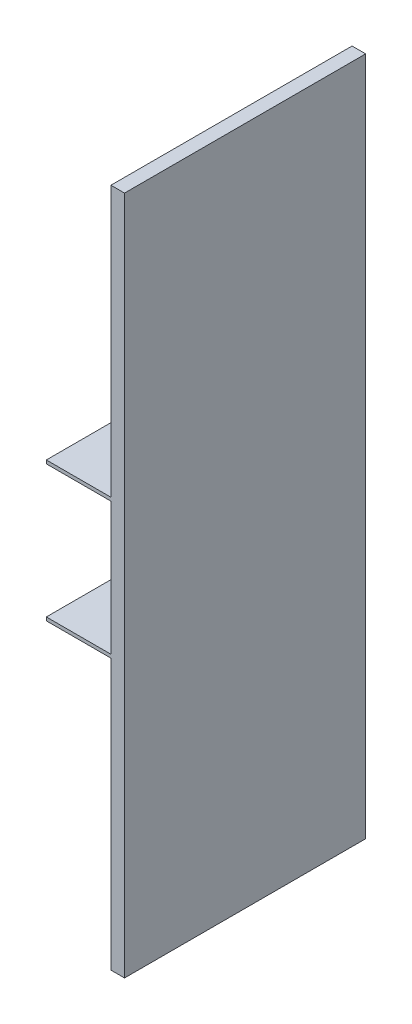
ISO-10303-21;
HEADER;
FILE_DESCRIPTION(('STEP AP214'),'2;1');
FILE_NAME('part.step','',(''),(''),'','','');
FILE_SCHEMA(('AUTOMOTIVE_DESIGN { 1 0 10303 214 1 1 1 1 }'));
ENDSEC;
DATA;
#1=APPLICATION_CONTEXT('core data for automotive mechanical design processes');
#2=APPLICATION_PROTOCOL_DEFINITION('international standard','automotive_design',2000,#1);
#3=PRODUCT_CONTEXT('',#1,'mechanical');
#4=PRODUCT('Part','Part','',(#3));
#5=PRODUCT_RELATED_PRODUCT_CATEGORY('part','',(#4));
#6=PRODUCT_DEFINITION_FORMATION('','',#4);
#7=PRODUCT_DEFINITION_CONTEXT('part definition',#1,'design');
#8=PRODUCT_DEFINITION('design','',#6,#7);
#9=PRODUCT_DEFINITION_SHAPE('','',#8);
#10=(LENGTH_UNIT() NAMED_UNIT(*) SI_UNIT(.MILLI.,.METRE.));
#11=(NAMED_UNIT(*) PLANE_ANGLE_UNIT() SI_UNIT($,.RADIAN.));
#12=(NAMED_UNIT(*) SI_UNIT($,.STERADIAN.) SOLID_ANGLE_UNIT());
#13=UNCERTAINTY_MEASURE_WITH_UNIT(LENGTH_MEASURE(1.E-05),#10,'distance_accuracy_value','');
#14=(GEOMETRIC_REPRESENTATION_CONTEXT(3) GLOBAL_UNCERTAINTY_ASSIGNED_CONTEXT((#13)) GLOBAL_UNIT_ASSIGNED_CONTEXT((#10,
#11,#12)) REPRESENTATION_CONTEXT('',''));
#15=CARTESIAN_POINT('',(0.,0.,0.));
#16=DIRECTION('',(0.,0.,1.));
#17=DIRECTION('',(1.,0.,0.));
#18=AXIS2_PLACEMENT_3D('',#15,#16,#17);
#19=CARTESIAN_POINT('',(7.5,0.,-35.475));
#20=DIRECTION('',(1.,0.,0.));
#21=DIRECTION('',(0.,0.,-1.));
#22=AXIS2_PLACEMENT_3D('',#19,#20,#21);
#23=PLANE('',#22);
#24=DIRECTION('',(0.,0.,1.));
#25=VECTOR('',#24,1.);
#26=CARTESIAN_POINT('',(7.5,119.5,-35.475));
#27=LINE('',#26,#25);
#28=CARTESIAN_POINT('',(7.5,119.5,-35.475));
#29=VERTEX_POINT('',#28);
#30=CARTESIAN_POINT('',(7.50000000000001,119.5,35.475));
#31=VERTEX_POINT('',#30);
#32=EDGE_CURVE('E58',#29,#31,#27,.T.);
#33=ORIENTED_EDGE('',*,*,#32,.F.);
#34=DIRECTION('',(0.,1.,0.));
#35=VECTOR('',#34,1.);
#36=CARTESIAN_POINT('',(7.5,0.,-35.475));
#37=LINE('',#36,#35);
#38=CARTESIAN_POINT('',(7.5,80.5,-35.475));
#39=VERTEX_POINT('',#38);
#40=EDGE_CURVE('E149',#39,#29,#37,.T.);
#41=ORIENTED_EDGE('',*,*,#40,.F.);
#42=DIRECTION('',(0.,0.,-1.));
#43=VECTOR('',#42,1.);
#44=CARTESIAN_POINT('',(7.5,80.5,-35.475));
#45=LINE('',#44,#43);
#46=CARTESIAN_POINT('',(7.50000000000001,80.5,35.475));
#47=VERTEX_POINT('',#46);
#48=EDGE_CURVE('E153',#47,#39,#45,.T.);
#49=ORIENTED_EDGE('',*,*,#48,.F.);
#50=DIRECTION('',(0.,1.,0.));
#51=VECTOR('',#50,1.);
#52=CARTESIAN_POINT('',(7.50000000000001,0.,35.475));
#53=LINE('',#52,#51);
#54=EDGE_CURVE('E175',#47,#31,#53,.T.);
#55=ORIENTED_EDGE('',*,*,#54,.T.);
#56=EDGE_LOOP('',(#33,#41,#49,#55));
#57=FACE_BOUND('',#56,.T.);
#58=ADVANCED_FACE('F33',(#57),#23,.F.);
#59=DIRECTION('',(0.,0.,-1.));
#60=VECTOR('',#59,1.);
#61=CARTESIAN_POINT('',(7.5,120.5,-35.475));
#62=LINE('',#61,#60);
#63=CARTESIAN_POINT('',(7.50000000000001,120.5,35.475));
#64=VERTEX_POINT('',#63);
#65=CARTESIAN_POINT('',(7.5,120.5,-35.475));
#66=VERTEX_POINT('',#65);
#67=EDGE_CURVE('E144',#64,#66,#62,.T.);
#68=ORIENTED_EDGE('',*,*,#67,.F.);
#69=CARTESIAN_POINT('',(7.50000000000001,200.,35.475));
#70=VERTEX_POINT('',#69);
#71=EDGE_CURVE('E198',#64,#70,#53,.T.);
#72=ORIENTED_EDGE('',*,*,#71,.T.);
#73=DIRECTION('',(0.,0.,-1.));
#74=VECTOR('',#73,1.);
#75=CARTESIAN_POINT('',(7.5,200.,-35.475));
#76=LINE('',#75,#74);
#77=CARTESIAN_POINT('',(7.5,200.,-35.475));
#78=VERTEX_POINT('',#77);
#79=EDGE_CURVE('E187',#70,#78,#76,.T.);
#80=ORIENTED_EDGE('',*,*,#79,.T.);
#81=EDGE_CURVE('E37',#66,#78,#37,.T.);
#82=ORIENTED_EDGE('',*,*,#81,.F.);
#83=EDGE_LOOP('',(#68,#72,#80,#82));
#84=FACE_BOUND('',#83,.T.);
#85=ADVANCED_FACE('F237',(#84),#23,.F.);
#86=DIRECTION('',(0.,0.,1.));
#87=VECTOR('',#86,1.);
#88=CARTESIAN_POINT('',(7.5,79.5,-35.475));
#89=LINE('',#88,#87);
#90=CARTESIAN_POINT('',(7.5,79.5,-35.475));
#91=VERTEX_POINT('',#90);
#92=CARTESIAN_POINT('',(7.50000000000001,79.5,35.475));
#93=VERTEX_POINT('',#92);
#94=EDGE_CURVE('E150',#91,#93,#89,.T.);
#95=ORIENTED_EDGE('',*,*,#94,.F.);
#96=CARTESIAN_POINT('',(7.5,0.,-35.475));
#97=VERTEX_POINT('',#96);
#98=EDGE_CURVE('E211',#97,#91,#37,.T.);
#99=ORIENTED_EDGE('',*,*,#98,.F.);
#100=DIRECTION('',(0.,0.,-1.));
#101=VECTOR('',#100,1.);
#102=CARTESIAN_POINT('',(7.5,0.,-35.475));
#103=LINE('',#102,#101);
#104=CARTESIAN_POINT('',(7.50000000000001,0.,35.475));
#105=VERTEX_POINT('',#104);
#106=EDGE_CURVE('E199',#105,#97,#103,.T.);
#107=ORIENTED_EDGE('',*,*,#106,.F.);
#108=EDGE_CURVE('E208',#105,#93,#53,.T.);
#109=ORIENTED_EDGE('',*,*,#108,.T.);
#110=EDGE_LOOP('',(#95,#99,#107,#109));
#111=FACE_BOUND('',#110,.T.);
#112=ADVANCED_FACE('F244',(#111),#23,.F.);
#113=CARTESIAN_POINT('',(11.5,200.,-35.475));
#114=DIRECTION('',(-1.,0.,0.));
#115=DIRECTION('',(0.,0.,1.));
#116=AXIS2_PLACEMENT_3D('',#113,#114,#115);
#117=PLANE('',#116);
#118=DIRECTION('',(0.,0.,-1.));
#119=VECTOR('',#118,1.);
#120=CARTESIAN_POINT('',(11.5,0.,-35.475));
#121=LINE('',#120,#119);
#122=CARTESIAN_POINT('',(11.5,0.,35.475));
#123=VERTEX_POINT('',#122);
#124=CARTESIAN_POINT('',(11.5,0.,-35.475));
#125=VERTEX_POINT('',#124);
#126=EDGE_CURVE('E213',#123,#125,#121,.T.);
#127=ORIENTED_EDGE('',*,*,#126,.T.);
#128=DIRECTION('',(0.,-1.,0.));
#129=VECTOR('',#128,1.);
#130=CARTESIAN_POINT('',(11.5,200.,-35.475));
#131=LINE('',#130,#129);
#132=CARTESIAN_POINT('',(11.5,200.,-35.475));
#133=VERTEX_POINT('',#132);
#134=EDGE_CURVE('E11',#133,#125,#131,.T.);
#135=ORIENTED_EDGE('',*,*,#134,.F.);
#136=DIRECTION('',(0.,0.,-1.));
#137=VECTOR('',#136,1.);
#138=CARTESIAN_POINT('',(11.5,200.,-35.475));
#139=LINE('',#138,#137);
#140=CARTESIAN_POINT('',(11.5,200.,35.475));
#141=VERTEX_POINT('',#140);
#142=EDGE_CURVE('E204',#141,#133,#139,.T.);
#143=ORIENTED_EDGE('',*,*,#142,.F.);
#144=DIRECTION('',(0.,-1.,0.));
#145=VECTOR('',#144,1.);
#146=CARTESIAN_POINT('',(11.5,200.,35.475));
#147=LINE('',#146,#145);
#148=EDGE_CURVE('E43',#141,#123,#147,.T.);
#149=ORIENTED_EDGE('',*,*,#148,.T.);
#150=EDGE_LOOP('',(#127,#135,#143,#149));
#151=FACE_BOUND('',#150,.T.);
#152=ADVANCED_FACE('F35',(#151),#117,.F.);
#153=CARTESIAN_POINT('',(-11.5,200.,-35.475));
#154=DIRECTION('',(0.,0.,1.));
#155=DIRECTION('',(1.,0.,0.));
#156=AXIS2_PLACEMENT_3D('',#153,#154,#155);
#157=PLANE('',#156);
#158=DIRECTION('',(-1.,0.,0.));
#159=VECTOR('',#158,1.);
#160=CARTESIAN_POINT('',(-11.5,0.,-35.475));
#161=LINE('',#160,#159);
#162=EDGE_CURVE('E220',#125,#97,#161,.T.);
#163=ORIENTED_EDGE('',*,*,#162,.T.);
#164=ORIENTED_EDGE('',*,*,#98,.T.);
#165=DIRECTION('',(1.,0.,0.));
#166=VECTOR('',#165,1.);
#167=CARTESIAN_POINT('',(-11.5,79.5,-35.475));
#168=LINE('',#167,#166);
#169=CARTESIAN_POINT('',(-11.5,79.5,-35.475));
#170=VERTEX_POINT('',#169);
#171=EDGE_CURVE('E181',#170,#91,#168,.T.);
#172=ORIENTED_EDGE('',*,*,#171,.F.);
#173=DIRECTION('',(0.,-1.,0.));
#174=VECTOR('',#173,1.);
#175=CARTESIAN_POINT('',(-11.5,79.5,-35.475));
#176=LINE('',#175,#174);
#177=CARTESIAN_POINT('',(-11.5,80.5,-35.475));
#178=VERTEX_POINT('',#177);
#179=EDGE_CURVE('E159',#178,#170,#176,.T.);
#180=ORIENTED_EDGE('',*,*,#179,.F.);
#181=DIRECTION('',(1.,0.,0.));
#182=VECTOR('',#181,1.);
#183=CARTESIAN_POINT('',(-11.5,80.5,-35.475));
#184=LINE('',#183,#182);
#185=EDGE_CURVE('E168',#178,#39,#184,.T.);
#186=ORIENTED_EDGE('',*,*,#185,.T.);
#187=ORIENTED_EDGE('',*,*,#40,.T.);
#188=DIRECTION('',(1.,0.,0.));
#189=VECTOR('',#188,1.);
#190=CARTESIAN_POINT('',(-11.5,119.5,-35.475));
#191=LINE('',#190,#189);
#192=CARTESIAN_POINT('',(-11.5,119.5,-35.475));
#193=VERTEX_POINT('',#192);
#194=EDGE_CURVE('E129',#193,#29,#191,.T.);
#195=ORIENTED_EDGE('',*,*,#194,.F.);
#196=DIRECTION('',(0.,-1.,0.));
#197=VECTOR('',#196,1.);
#198=CARTESIAN_POINT('',(-11.5,120.5,-35.475));
#199=LINE('',#198,#197);
#200=CARTESIAN_POINT('',(-11.5,120.5,-35.475));
#201=VERTEX_POINT('',#200);
#202=EDGE_CURVE('E135',#201,#193,#199,.T.);
#203=ORIENTED_EDGE('',*,*,#202,.F.);
#204=DIRECTION('',(1.,0.,0.));
#205=VECTOR('',#204,1.);
#206=CARTESIAN_POINT('',(-11.5,120.5,-35.475));
#207=LINE('',#206,#205);
#208=EDGE_CURVE('E236',#201,#66,#207,.T.);
#209=ORIENTED_EDGE('',*,*,#208,.T.);
#210=ORIENTED_EDGE('',*,*,#81,.T.);
#211=DIRECTION('',(-1.,0.,0.));
#212=VECTOR('',#211,1.);
#213=CARTESIAN_POINT('',(-11.5,200.,-35.475));
#214=LINE('',#213,#212);
#215=EDGE_CURVE('E224',#133,#78,#214,.T.);
#216=ORIENTED_EDGE('',*,*,#215,.F.);
#217=ORIENTED_EDGE('',*,*,#134,.T.);
#218=EDGE_LOOP('',(#163,#164,#172,#180,#186,#187,#195,#203,#209,#210,#216,#217));
#219=FACE_BOUND('',#218,.T.);
#220=ADVANCED_FACE('F147',(#219),#157,.F.);
#221=CARTESIAN_POINT('',(-11.5,200.,35.475));
#222=DIRECTION('',(0.,0.,-1.));
#223=DIRECTION('',(-1.,0.,0.));
#224=AXIS2_PLACEMENT_3D('',#221,#222,#223);
#225=PLANE('',#224);
#226=DIRECTION('',(1.,0.,0.));
#227=VECTOR('',#226,1.);
#228=CARTESIAN_POINT('',(-11.5,200.,35.475));
#229=LINE('',#228,#227);
#230=EDGE_CURVE('E217',#70,#141,#229,.T.);
#231=ORIENTED_EDGE('',*,*,#230,.F.);
#232=ORIENTED_EDGE('',*,*,#71,.F.);
#233=DIRECTION('',(1.,0.,0.));
#234=VECTOR('',#233,1.);
#235=CARTESIAN_POINT('',(-11.5,120.5,35.475));
#236=LINE('',#235,#234);
#237=CARTESIAN_POINT('',(-11.5,120.5,35.475));
#238=VERTEX_POINT('',#237);
#239=EDGE_CURVE('E155',#238,#64,#236,.T.);
#240=ORIENTED_EDGE('',*,*,#239,.F.);
#241=DIRECTION('',(0.,1.,0.));
#242=VECTOR('',#241,1.);
#243=CARTESIAN_POINT('',(-11.5,120.5,35.475));
#244=LINE('',#243,#242);
#245=CARTESIAN_POINT('',(-11.5,119.5,35.475));
#246=VERTEX_POINT('',#245);
#247=EDGE_CURVE('E134',#246,#238,#244,.T.);
#248=ORIENTED_EDGE('',*,*,#247,.F.);
#249=DIRECTION('',(1.,0.,0.));
#250=VECTOR('',#249,1.);
#251=CARTESIAN_POINT('',(-11.5,119.5,35.475));
#252=LINE('',#251,#250);
#253=EDGE_CURVE('E131',#246,#31,#252,.T.);
#254=ORIENTED_EDGE('',*,*,#253,.T.);
#255=ORIENTED_EDGE('',*,*,#54,.F.);
#256=DIRECTION('',(1.,0.,0.));
#257=VECTOR('',#256,1.);
#258=CARTESIAN_POINT('',(-11.5,80.5,35.475));
#259=LINE('',#258,#257);
#260=CARTESIAN_POINT('',(-11.5,80.5,35.475));
#261=VERTEX_POINT('',#260);
#262=EDGE_CURVE('E182',#261,#47,#259,.T.);
#263=ORIENTED_EDGE('',*,*,#262,.F.);
#264=DIRECTION('',(0.,1.,0.));
#265=VECTOR('',#264,1.);
#266=CARTESIAN_POINT('',(-11.5,79.5,35.475));
#267=LINE('',#266,#265);
#268=CARTESIAN_POINT('',(-11.5,79.5,35.475));
#269=VERTEX_POINT('',#268);
#270=EDGE_CURVE('E164',#269,#261,#267,.T.);
#271=ORIENTED_EDGE('',*,*,#270,.F.);
#272=DIRECTION('',(1.,0.,0.));
#273=VECTOR('',#272,1.);
#274=CARTESIAN_POINT('',(-11.5,79.5,35.475));
#275=LINE('',#274,#273);
#276=EDGE_CURVE('E178',#269,#93,#275,.T.);
#277=ORIENTED_EDGE('',*,*,#276,.T.);
#278=ORIENTED_EDGE('',*,*,#108,.F.);
#279=DIRECTION('',(1.,0.,0.));
#280=VECTOR('',#279,1.);
#281=CARTESIAN_POINT('',(-11.5,0.,35.475));
#282=LINE('',#281,#280);
#283=EDGE_CURVE('E218',#105,#123,#282,.T.);
#284=ORIENTED_EDGE('',*,*,#283,.T.);
#285=ORIENTED_EDGE('',*,*,#148,.F.);
#286=EDGE_LOOP('',(#231,#232,#240,#248,#254,#255,#263,#271,#277,#278,#284,#285));
#287=FACE_BOUND('',#286,.T.);
#288=ADVANCED_FACE('F246',(#287),#225,.F.);
#289=CARTESIAN_POINT('',(0.,200.,0.));
#290=DIRECTION('',(0.,1.,0.));
#291=DIRECTION('',(0.,0.,1.));
#292=AXIS2_PLACEMENT_3D('',#289,#290,#291);
#293=PLANE('',#292);
#294=ORIENTED_EDGE('',*,*,#79,.F.);
#295=ORIENTED_EDGE('',*,*,#230,.T.);
#296=ORIENTED_EDGE('',*,*,#142,.T.);
#297=ORIENTED_EDGE('',*,*,#215,.T.);
#298=EDGE_LOOP('',(#294,#295,#296,#297));
#299=FACE_BOUND('',#298,.T.);
#300=ADVANCED_FACE('F231',(#299),#293,.T.);
#301=CARTESIAN_POINT('',(0.,0.,0.));
#302=DIRECTION('',(0.,1.,0.));
#303=DIRECTION('',(0.,0.,1.));
#304=AXIS2_PLACEMENT_3D('',#301,#302,#303);
#305=PLANE('',#304);
#306=ORIENTED_EDGE('',*,*,#283,.F.);
#307=ORIENTED_EDGE('',*,*,#106,.T.);
#308=ORIENTED_EDGE('',*,*,#162,.F.);
#309=ORIENTED_EDGE('',*,*,#126,.F.);
#310=EDGE_LOOP('',(#306,#307,#308,#309));
#311=FACE_BOUND('',#310,.T.);
#312=ADVANCED_FACE('F241',(#311),#305,.F.);
#313=CARTESIAN_POINT('',(-11.5,79.5,-35.475));
#314=DIRECTION('',(0.,1.,0.));
#315=DIRECTION('',(0.,0.,1.));
#316=AXIS2_PLACEMENT_3D('',#313,#314,#315);
#317=PLANE('',#316);
#318=ORIENTED_EDGE('',*,*,#94,.T.);
#319=ORIENTED_EDGE('',*,*,#276,.F.);
#320=DIRECTION('',(0.,0.,1.));
#321=VECTOR('',#320,1.);
#322=CARTESIAN_POINT('',(-11.5,79.5,-35.475));
#323=LINE('',#322,#321);
#324=EDGE_CURVE('E162',#170,#269,#323,.T.);
#325=ORIENTED_EDGE('',*,*,#324,.F.);
#326=ORIENTED_EDGE('',*,*,#171,.T.);
#327=EDGE_LOOP('',(#318,#319,#325,#326));
#328=FACE_BOUND('',#327,.T.);
#329=ADVANCED_FACE('F251',(#328),#317,.F.);
#330=CARTESIAN_POINT('',(-11.5,80.5,-35.475));
#331=DIRECTION('',(0.,-1.,0.));
#332=DIRECTION('',(0.,0.,-1.));
#333=AXIS2_PLACEMENT_3D('',#330,#331,#332);
#334=PLANE('',#333);
#335=ORIENTED_EDGE('',*,*,#48,.T.);
#336=ORIENTED_EDGE('',*,*,#185,.F.);
#337=DIRECTION('',(0.,0.,-1.));
#338=VECTOR('',#337,1.);
#339=CARTESIAN_POINT('',(-11.5,80.5,-35.475));
#340=LINE('',#339,#338);
#341=EDGE_CURVE('E166',#261,#178,#340,.T.);
#342=ORIENTED_EDGE('',*,*,#341,.F.);
#343=ORIENTED_EDGE('',*,*,#262,.T.);
#344=EDGE_LOOP('',(#335,#336,#342,#343));
#345=FACE_BOUND('',#344,.T.);
#346=ADVANCED_FACE('F259',(#345),#334,.F.);
#347=CARTESIAN_POINT('',(-11.5,0.,0.));
#348=DIRECTION('',(1.,0.,0.));
#349=DIRECTION('',(0.,0.,-1.));
#350=AXIS2_PLACEMENT_3D('',#347,#348,#349);
#351=PLANE('',#350);
#352=ORIENTED_EDGE('',*,*,#179,.T.);
#353=ORIENTED_EDGE('',*,*,#324,.T.);
#354=ORIENTED_EDGE('',*,*,#270,.T.);
#355=ORIENTED_EDGE('',*,*,#341,.T.);
#356=EDGE_LOOP('',(#352,#353,#354,#355));
#357=FACE_BOUND('',#356,.T.);
#358=ADVANCED_FACE('F256',(#357),#351,.F.);
#359=CARTESIAN_POINT('',(-11.5,119.5,-35.475));
#360=DIRECTION('',(0.,1.,0.));
#361=DIRECTION('',(0.,0.,1.));
#362=AXIS2_PLACEMENT_3D('',#359,#360,#361);
#363=PLANE('',#362);
#364=ORIENTED_EDGE('',*,*,#32,.T.);
#365=ORIENTED_EDGE('',*,*,#253,.F.);
#366=DIRECTION('',(0.,0.,1.));
#367=VECTOR('',#366,1.);
#368=CARTESIAN_POINT('',(-11.5,119.5,-35.475));
#369=LINE('',#368,#367);
#370=EDGE_CURVE('E125',#193,#246,#369,.T.);
#371=ORIENTED_EDGE('',*,*,#370,.F.);
#372=ORIENTED_EDGE('',*,*,#194,.T.);
#373=EDGE_LOOP('',(#364,#365,#371,#372));
#374=FACE_BOUND('',#373,.T.);
#375=ADVANCED_FACE('F127',(#374),#363,.F.);
#376=CARTESIAN_POINT('',(-11.5,120.5,-35.475));
#377=DIRECTION('',(0.,-1.,0.));
#378=DIRECTION('',(0.,0.,-1.));
#379=AXIS2_PLACEMENT_3D('',#376,#377,#378);
#380=PLANE('',#379);
#381=ORIENTED_EDGE('',*,*,#67,.T.);
#382=ORIENTED_EDGE('',*,*,#208,.F.);
#383=DIRECTION('',(0.,0.,-1.));
#384=VECTOR('',#383,1.);
#385=CARTESIAN_POINT('',(-11.5,120.5,-35.475));
#386=LINE('',#385,#384);
#387=EDGE_CURVE('E140',#238,#201,#386,.T.);
#388=ORIENTED_EDGE('',*,*,#387,.F.);
#389=ORIENTED_EDGE('',*,*,#239,.T.);
#390=EDGE_LOOP('',(#381,#382,#388,#389));
#391=FACE_BOUND('',#390,.T.);
#392=ADVANCED_FACE('F269',(#391),#380,.F.);
#393=CARTESIAN_POINT('',(-11.5,0.,0.));
#394=DIRECTION('',(-1.,0.,0.));
#395=DIRECTION('',(0.,0.,1.));
#396=AXIS2_PLACEMENT_3D('',#393,#394,#395);
#397=PLANE('',#396);
#398=ORIENTED_EDGE('',*,*,#202,.T.);
#399=ORIENTED_EDGE('',*,*,#370,.T.);
#400=ORIENTED_EDGE('',*,*,#247,.T.);
#401=ORIENTED_EDGE('',*,*,#387,.T.);
#402=EDGE_LOOP('',(#398,#399,#400,#401));
#403=FACE_BOUND('',#402,.T.);
#404=ADVANCED_FACE('F138',(#403),#397,.T.);
#405=CLOSED_SHELL('',(#58,#85,#112,#152,#220,#288,#300,#312,#329,#346,#358,#375,#392,#404));
#406=MANIFOLD_SOLID_BREP('B2',#405);
#407=ADVANCED_BREP_SHAPE_REPRESENTATION('',(#18,#406),#14);
#408=SHAPE_DEFINITION_REPRESENTATION(#9,#407);
ENDSEC;
END-ISO-10303-21;
